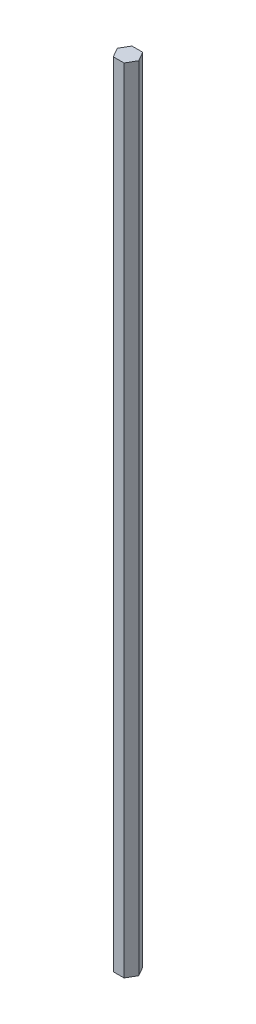
ISO-10303-21;
HEADER;
FILE_DESCRIPTION(('STEP AP214'),'2;1');
FILE_NAME('part.step','',(''),(''),'','','');
FILE_SCHEMA(('AUTOMOTIVE_DESIGN { 1 0 10303 214 1 1 1 1 }'));
ENDSEC;
DATA;
#1=APPLICATION_CONTEXT('core data for automotive mechanical design processes');
#2=APPLICATION_PROTOCOL_DEFINITION('international standard','automotive_design',2000,#1);
#3=PRODUCT_CONTEXT('',#1,'mechanical');
#4=PRODUCT('Part','Part','',(#3));
#5=PRODUCT_RELATED_PRODUCT_CATEGORY('part','',(#4));
#6=PRODUCT_DEFINITION_FORMATION('','',#4);
#7=PRODUCT_DEFINITION_CONTEXT('part definition',#1,'design');
#8=PRODUCT_DEFINITION('design','',#6,#7);
#9=PRODUCT_DEFINITION_SHAPE('','',#8);
#10=(LENGTH_UNIT() NAMED_UNIT(*) SI_UNIT(.MILLI.,.METRE.));
#11=(NAMED_UNIT(*) PLANE_ANGLE_UNIT() SI_UNIT($,.RADIAN.));
#12=(NAMED_UNIT(*) SI_UNIT($,.STERADIAN.) SOLID_ANGLE_UNIT());
#13=UNCERTAINTY_MEASURE_WITH_UNIT(LENGTH_MEASURE(1.E-05),#10,'distance_accuracy_value','');
#14=(GEOMETRIC_REPRESENTATION_CONTEXT(3) GLOBAL_UNCERTAINTY_ASSIGNED_CONTEXT((#13)) GLOBAL_UNIT_ASSIGNED_CONTEXT((#10,
#11,#12)) REPRESENTATION_CONTEXT('',''));
#15=CARTESIAN_POINT('',(0.,0.,0.));
#16=DIRECTION('',(0.,0.,1.));
#17=DIRECTION('',(1.,0.,0.));
#18=AXIS2_PLACEMENT_3D('',#15,#16,#17);
#19=CARTESIAN_POINT('',(3.6661742093542,539.75,6.34999999999996));
#20=DIRECTION('',(-0.866025403784442,0.,-0.499999999999995));
#21=DIRECTION('',(-0.499999999999995,0.,0.866025403784441));
#22=AXIS2_PLACEMENT_3D('',#19,#20,#21);
#23=PLANE('',#22);
#24=DIRECTION('',(0.499999999999995,0.,-0.866025403784441));
#25=VECTOR('',#24,1.);
#26=CARTESIAN_POINT('',(3.6661742093542,0.,6.34999999999996));
#27=LINE('',#26,#25);
#28=CARTESIAN_POINT('',(3.6661742093542,0.,6.34999999999996));
#29=VERTEX_POINT('',#28);
#30=CARTESIAN_POINT('',(7.33234841870825,0.,0.));
#31=VERTEX_POINT('',#30);
#32=EDGE_CURVE('E123',#29,#31,#27,.T.);
#33=ORIENTED_EDGE('',*,*,#32,.T.);
#34=DIRECTION('',(0.,-1.,0.));
#35=VECTOR('',#34,1.);
#36=CARTESIAN_POINT('',(7.33234841870825,539.75,0.));
#37=LINE('',#36,#35);
#38=CARTESIAN_POINT('',(7.33234841870825,539.75,0.));
#39=VERTEX_POINT('',#38);
#40=EDGE_CURVE('E11',#39,#31,#37,.T.);
#41=ORIENTED_EDGE('',*,*,#40,.F.);
#42=DIRECTION('',(0.499999999999995,0.,-0.866025403784441));
#43=VECTOR('',#42,1.);
#44=CARTESIAN_POINT('',(3.6661742093542,539.75,6.34999999999996));
#45=LINE('',#44,#43);
#46=CARTESIAN_POINT('',(3.6661742093542,539.75,6.34999999999996));
#47=VERTEX_POINT('',#46);
#48=EDGE_CURVE('E133',#47,#39,#45,.T.);
#49=ORIENTED_EDGE('',*,*,#48,.F.);
#50=DIRECTION('',(0.,-1.,0.));
#51=VECTOR('',#50,1.);
#52=CARTESIAN_POINT('',(3.6661742093542,539.75,6.34999999999996));
#53=LINE('',#52,#51);
#54=EDGE_CURVE('E119',#47,#29,#53,.T.);
#55=ORIENTED_EDGE('',*,*,#54,.T.);
#56=EDGE_LOOP('',(#33,#41,#49,#55));
#57=FACE_BOUND('',#56,.T.);
#58=ADVANCED_FACE('F39',(#57),#23,.F.);
#59=CARTESIAN_POINT('',(7.33234841870825,539.75,0.));
#60=DIRECTION('',(-0.866025403784438,0.,0.500000000000001));
#61=DIRECTION('',(0.500000000000001,0.,0.866025403784438));
#62=AXIS2_PLACEMENT_3D('',#59,#60,#61);
#63=PLANE('',#62);
#64=DIRECTION('',(-0.500000000000001,0.,-0.866025403784438));
#65=VECTOR('',#64,1.);
#66=CARTESIAN_POINT('',(7.33234841870825,0.,0.));
#67=LINE('',#66,#65);
#68=CARTESIAN_POINT('',(3.66617420935411,0.,-6.35000000000001));
#69=VERTEX_POINT('',#68);
#70=EDGE_CURVE('E126',#31,#69,#67,.T.);
#71=ORIENTED_EDGE('',*,*,#70,.T.);
#72=DIRECTION('',(0.,-1.,0.));
#73=VECTOR('',#72,1.);
#74=CARTESIAN_POINT('',(3.66617420935411,539.75,-6.35000000000001));
#75=LINE('',#74,#73);
#76=CARTESIAN_POINT('',(3.66617420935411,539.75,-6.35000000000001));
#77=VERTEX_POINT('',#76);
#78=EDGE_CURVE('E47',#77,#69,#75,.T.);
#79=ORIENTED_EDGE('',*,*,#78,.F.);
#80=DIRECTION('',(-0.500000000000001,0.,-0.866025403784438));
#81=VECTOR('',#80,1.);
#82=CARTESIAN_POINT('',(7.33234841870825,539.75,0.));
#83=LINE('',#82,#81);
#84=EDGE_CURVE('E92',#39,#77,#83,.T.);
#85=ORIENTED_EDGE('',*,*,#84,.F.);
#86=ORIENTED_EDGE('',*,*,#40,.T.);
#87=EDGE_LOOP('',(#71,#79,#85,#86));
#88=FACE_BOUND('',#87,.T.);
#89=ADVANCED_FACE('F157',(#88),#63,.F.);
#90=CARTESIAN_POINT('',(3.66617420935411,539.75,-6.35000000000001));
#91=DIRECTION('',(0.,0.,1.));
#92=DIRECTION('',(1.,0.,0.));
#93=AXIS2_PLACEMENT_3D('',#90,#91,#92);
#94=PLANE('',#93);
#95=DIRECTION('',(-1.,0.,0.));
#96=VECTOR('',#95,1.);
#97=CARTESIAN_POINT('',(3.66617420935411,0.,-6.35000000000001));
#98=LINE('',#97,#96);
#99=CARTESIAN_POINT('',(-3.66617420935416,0.,-6.34999999999999));
#100=VERTEX_POINT('',#99);
#101=EDGE_CURVE('E128',#69,#100,#98,.T.);
#102=ORIENTED_EDGE('',*,*,#101,.T.);
#103=DIRECTION('',(0.,-1.,0.));
#104=VECTOR('',#103,1.);
#105=CARTESIAN_POINT('',(-3.66617420935416,539.75,-6.34999999999999));
#106=LINE('',#105,#104);
#107=CARTESIAN_POINT('',(-3.66617420935416,539.75,-6.34999999999999));
#108=VERTEX_POINT('',#107);
#109=EDGE_CURVE('E114',#108,#100,#106,.T.);
#110=ORIENTED_EDGE('',*,*,#109,.F.);
#111=DIRECTION('',(-1.,0.,0.));
#112=VECTOR('',#111,1.);
#113=CARTESIAN_POINT('',(3.66617420935411,539.75,-6.35000000000001));
#114=LINE('',#113,#112);
#115=EDGE_CURVE('E105',#77,#108,#114,.T.);
#116=ORIENTED_EDGE('',*,*,#115,.F.);
#117=ORIENTED_EDGE('',*,*,#78,.T.);
#118=EDGE_LOOP('',(#102,#110,#116,#117));
#119=FACE_BOUND('',#118,.T.);
#120=ADVANCED_FACE('F139',(#119),#94,.F.);
#121=CARTESIAN_POINT('',(-3.66617420935416,539.75,-6.34999999999999));
#122=DIRECTION('',(0.866025403784442,0.,0.499999999999995));
#123=DIRECTION('',(0.499999999999995,0.,-0.866025403784441));
#124=AXIS2_PLACEMENT_3D('',#121,#122,#123);
#125=PLANE('',#124);
#126=DIRECTION('',(-0.499999999999995,0.,0.866025403784441));
#127=VECTOR('',#126,1.);
#128=CARTESIAN_POINT('',(-3.66617420935416,0.,-6.34999999999999));
#129=LINE('',#128,#127);
#130=CARTESIAN_POINT('',(-7.33234841870825,0.,0.));
#131=VERTEX_POINT('',#130);
#132=EDGE_CURVE('E113',#100,#131,#129,.T.);
#133=ORIENTED_EDGE('',*,*,#132,.T.);
#134=DIRECTION('',(0.,-1.,0.));
#135=VECTOR('',#134,1.);
#136=CARTESIAN_POINT('',(-7.33234841870825,539.75,0.));
#137=LINE('',#136,#135);
#138=CARTESIAN_POINT('',(-7.33234841870825,539.75,0.));
#139=VERTEX_POINT('',#138);
#140=EDGE_CURVE('E110',#139,#131,#137,.T.);
#141=ORIENTED_EDGE('',*,*,#140,.F.);
#142=DIRECTION('',(-0.499999999999995,0.,0.866025403784441));
#143=VECTOR('',#142,1.);
#144=CARTESIAN_POINT('',(-3.66617420935416,539.75,-6.34999999999999));
#145=LINE('',#144,#143);
#146=EDGE_CURVE('E99',#108,#139,#145,.T.);
#147=ORIENTED_EDGE('',*,*,#146,.F.);
#148=ORIENTED_EDGE('',*,*,#109,.T.);
#149=EDGE_LOOP('',(#133,#141,#147,#148));
#150=FACE_BOUND('',#149,.T.);
#151=ADVANCED_FACE('F111',(#150),#125,.F.);
#152=CARTESIAN_POINT('',(-7.33234841870825,539.75,0.));
#153=DIRECTION('',(0.866025403784435,0.,-0.500000000000007));
#154=DIRECTION('',(-0.500000000000007,0.,-0.866025403784435));
#155=AXIS2_PLACEMENT_3D('',#152,#153,#154);
#156=PLANE('',#155);
#157=DIRECTION('',(0.500000000000007,0.,0.866025403784435));
#158=VECTOR('',#157,1.);
#159=CARTESIAN_POINT('',(-7.33234841870825,0.,0.));
#160=LINE('',#159,#158);
#161=CARTESIAN_POINT('',(-3.66617420935407,0.,6.35000000000004));
#162=VERTEX_POINT('',#161);
#163=EDGE_CURVE('E78',#131,#162,#160,.T.);
#164=ORIENTED_EDGE('',*,*,#163,.T.);
#165=DIRECTION('',(0.,-1.,0.));
#166=VECTOR('',#165,1.);
#167=CARTESIAN_POINT('',(-3.66617420935407,539.75,6.35000000000004));
#168=LINE('',#167,#166);
#169=CARTESIAN_POINT('',(-3.66617420935407,539.75,6.35000000000004));
#170=VERTEX_POINT('',#169);
#171=EDGE_CURVE('E115',#170,#162,#168,.T.);
#172=ORIENTED_EDGE('',*,*,#171,.F.);
#173=DIRECTION('',(0.500000000000007,0.,0.866025403784435));
#174=VECTOR('',#173,1.);
#175=CARTESIAN_POINT('',(-7.33234841870825,539.75,0.));
#176=LINE('',#175,#174);
#177=EDGE_CURVE('E103',#139,#170,#176,.T.);
#178=ORIENTED_EDGE('',*,*,#177,.F.);
#179=ORIENTED_EDGE('',*,*,#140,.T.);
#180=EDGE_LOOP('',(#164,#172,#178,#179));
#181=FACE_BOUND('',#180,.T.);
#182=ADVANCED_FACE('F117',(#181),#156,.F.);
#183=CARTESIAN_POINT('',(-3.66617420935407,539.75,6.35000000000004));
#184=DIRECTION('',(0.,0.,-1.));
#185=DIRECTION('',(-1.,0.,0.));
#186=AXIS2_PLACEMENT_3D('',#183,#184,#185);
#187=PLANE('',#186);
#188=DIRECTION('',(1.,0.,0.));
#189=VECTOR('',#188,1.);
#190=CARTESIAN_POINT('',(-3.66617420935407,0.,6.35000000000004));
#191=LINE('',#190,#189);
#192=EDGE_CURVE('E84',#162,#29,#191,.T.);
#193=ORIENTED_EDGE('',*,*,#192,.T.);
#194=ORIENTED_EDGE('',*,*,#54,.F.);
#195=DIRECTION('',(1.,0.,0.));
#196=VECTOR('',#195,1.);
#197=CARTESIAN_POINT('',(-3.66617420935407,539.75,6.35000000000004));
#198=LINE('',#197,#196);
#199=EDGE_CURVE('E55',#170,#47,#198,.T.);
#200=ORIENTED_EDGE('',*,*,#199,.F.);
#201=ORIENTED_EDGE('',*,*,#171,.T.);
#202=EDGE_LOOP('',(#193,#194,#200,#201));
#203=FACE_BOUND('',#202,.T.);
#204=ADVANCED_FACE('F146',(#203),#187,.F.);
#205=CARTESIAN_POINT('',(0.,539.75,0.));
#206=DIRECTION('',(0.,1.,0.));
#207=DIRECTION('',(0.,0.,1.));
#208=AXIS2_PLACEMENT_3D('',#205,#206,#207);
#209=PLANE('',#208);
#210=ORIENTED_EDGE('',*,*,#48,.T.);
#211=ORIENTED_EDGE('',*,*,#84,.T.);
#212=ORIENTED_EDGE('',*,*,#115,.T.);
#213=ORIENTED_EDGE('',*,*,#146,.T.);
#214=ORIENTED_EDGE('',*,*,#177,.T.);
#215=ORIENTED_EDGE('',*,*,#199,.T.);
#216=EDGE_LOOP('',(#210,#211,#212,#213,#214,#215));
#217=FACE_BOUND('',#216,.T.);
#218=ADVANCED_FACE('F101',(#217),#209,.T.);
#219=CARTESIAN_POINT('',(0.,0.,0.));
#220=DIRECTION('',(0.,1.,0.));
#221=DIRECTION('',(0.,0.,1.));
#222=AXIS2_PLACEMENT_3D('',#219,#220,#221);
#223=PLANE('',#222);
#224=ORIENTED_EDGE('',*,*,#32,.F.);
#225=ORIENTED_EDGE('',*,*,#192,.F.);
#226=ORIENTED_EDGE('',*,*,#163,.F.);
#227=ORIENTED_EDGE('',*,*,#132,.F.);
#228=ORIENTED_EDGE('',*,*,#101,.F.);
#229=ORIENTED_EDGE('',*,*,#70,.F.);
#230=EDGE_LOOP('',(#224,#225,#226,#227,#228,#229));
#231=FACE_BOUND('',#230,.T.);
#232=ADVANCED_FACE('F142',(#231),#223,.F.);
#233=CLOSED_SHELL('',(#58,#89,#120,#151,#182,#204,#218,#232));
#234=MANIFOLD_SOLID_BREP('B2',#233);
#235=ADVANCED_BREP_SHAPE_REPRESENTATION('',(#18,#234),#14);
#236=SHAPE_DEFINITION_REPRESENTATION(#9,#235);
ENDSEC;
END-ISO-10303-21;
